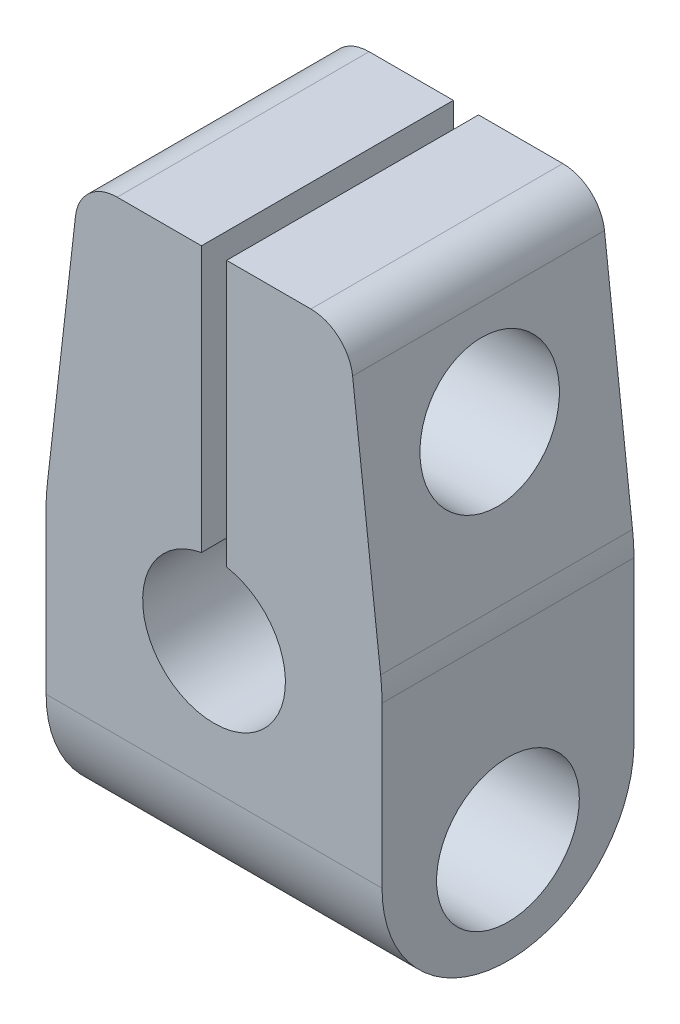
ISO-10303-21;
HEADER;
FILE_DESCRIPTION(('STEP AP214'),'2;1');
FILE_NAME('part.step','',(''),(''),'','','');
FILE_SCHEMA(('AUTOMOTIVE_DESIGN { 1 0 10303 214 1 1 1 1 }'));
ENDSEC;
DATA;
#1=APPLICATION_CONTEXT('core data for automotive mechanical design processes');
#2=APPLICATION_PROTOCOL_DEFINITION('international standard','automotive_design',2000,#1);
#3=PRODUCT_CONTEXT('',#1,'mechanical');
#4=PRODUCT('Part','Part','',(#3));
#5=PRODUCT_RELATED_PRODUCT_CATEGORY('part','',(#4));
#6=PRODUCT_DEFINITION_FORMATION('','',#4);
#7=PRODUCT_DEFINITION_CONTEXT('part definition',#1,'design');
#8=PRODUCT_DEFINITION('design','',#6,#7);
#9=PRODUCT_DEFINITION_SHAPE('','',#8);
#10=(LENGTH_UNIT() NAMED_UNIT(*) SI_UNIT(.MILLI.,.METRE.));
#11=(NAMED_UNIT(*) PLANE_ANGLE_UNIT() SI_UNIT($,.RADIAN.));
#12=(NAMED_UNIT(*) SI_UNIT($,.STERADIAN.) SOLID_ANGLE_UNIT());
#13=UNCERTAINTY_MEASURE_WITH_UNIT(LENGTH_MEASURE(1.E-05),#10,'distance_accuracy_value','');
#14=(GEOMETRIC_REPRESENTATION_CONTEXT(3) GLOBAL_UNCERTAINTY_ASSIGNED_CONTEXT((#13)) GLOBAL_UNIT_ASSIGNED_CONTEXT((#10,
#11,#12)) REPRESENTATION_CONTEXT('',''));
#15=CARTESIAN_POINT('',(0.,0.,0.));
#16=DIRECTION('',(0.,0.,1.));
#17=DIRECTION('',(1.,0.,0.));
#18=AXIS2_PLACEMENT_3D('',#15,#16,#17);
#19=CARTESIAN_POINT('',(4.,-6.5,6.));
#20=DIRECTION('',(-1.,0.,0.));
#21=DIRECTION('',(0.,-1.,0.));
#22=AXIS2_PLACEMENT_3D('',#19,#20,#21);
#23=PLANE('',#22);
#24=CARTESIAN_POINT('',(4.,-3.6,3.));
#25=DIRECTION('',(1.,0.,0.));
#26=DIRECTION('',(0.,0.,-1.));
#27=AXIS2_PLACEMENT_3D('',#24,#25,#26);
#28=CIRCLE('',#27,1.7);
#29=CARTESIAN_POINT('',(4.,-3.6,1.3));
#30=VERTEX_POINT('',#29);
#31=EDGE_CURVE('E312',#30,#30,#28,.T.);
#32=ORIENTED_EDGE('',*,*,#31,.F.);
#33=EDGE_LOOP('',(#32));
#34=FACE_BOUND('',#33,.T.);
#35=DIRECTION('',(0.,0.,1.));
#36=VECTOR('',#35,1.);
#37=CARTESIAN_POINT('',(4.,-3.1,5.9991173190716));
#38=LINE('',#37,#36);
#39=CARTESIAN_POINT('',(4.,-3.1,5.9991173190716));
#40=VERTEX_POINT('',#39);
#41=CARTESIAN_POINT('',(4.,-3.1,6.));
#42=VERTEX_POINT('',#41);
#43=EDGE_CURVE('E295',#40,#42,#38,.T.);
#44=ORIENTED_EDGE('',*,*,#43,.F.);
#45=CARTESIAN_POINT('',(4.,-3.1,2.99911731907161));
#46=DIRECTION('',(-1.,0.,0.));
#47=DIRECTION('',(0.,-1.,0.));
#48=AXIS2_PLACEMENT_3D('',#45,#46,#47);
#49=CIRCLE('',#48,3.);
#50=CARTESIAN_POINT('',(4.,-3.17276885628309,0.));
#51=VERTEX_POINT('',#50);
#52=EDGE_CURVE('E291',#51,#40,#49,.T.);
#53=ORIENTED_EDGE('',*,*,#52,.F.);
#54=DIRECTION('',(0.,1.,0.));
#55=VECTOR('',#54,1.);
#56=CARTESIAN_POINT('',(4.,-6.5,0.));
#57=LINE('',#56,#55);
#58=CARTESIAN_POINT('',(4.,0.714692101296261,0.));
#59=VERTEX_POINT('',#58);
#60=EDGE_CURVE('E172',#51,#59,#57,.T.);
#61=ORIENTED_EDGE('',*,*,#60,.T.);
#62=DIRECTION('',(0.,0.,-1.));
#63=VECTOR('',#62,1.);
#64=CARTESIAN_POINT('',(4.,0.714692101296261,6.));
#65=LINE('',#64,#63);
#66=CARTESIAN_POINT('',(4.,0.714692101296261,6.));
#67=VERTEX_POINT('',#66);
#68=EDGE_CURVE('E11',#67,#59,#65,.T.);
#69=ORIENTED_EDGE('',*,*,#68,.F.);
#70=DIRECTION('',(0.,1.,0.));
#71=VECTOR('',#70,1.);
#72=CARTESIAN_POINT('',(4.,-6.5,6.));
#73=LINE('',#72,#71);
#74=EDGE_CURVE('E114',#42,#67,#73,.T.);
#75=ORIENTED_EDGE('',*,*,#74,.F.);
#76=EDGE_LOOP('',(#44,#53,#61,#69,#75));
#77=FACE_BOUND('',#76,.T.);
#78=ADVANCED_FACE('F37',(#34,#77),#23,.F.);
#79=CARTESIAN_POINT('',(-1.,0.714692101296261,6.));
#80=DIRECTION('',(0.,0.,-1.));
#81=DIRECTION('',(-1.,0.,0.));
#82=AXIS2_PLACEMENT_3D('',#79,#80,#81);
#83=CYLINDRICAL_SURFACE('',#82,5.);
#84=CARTESIAN_POINT('',(-1.,0.714692101296261,0.));
#85=DIRECTION('',(0.,0.,1.));
#86=DIRECTION('',(1.,0.,0.));
#87=AXIS2_PLACEMENT_3D('',#84,#85,#86);
#88=CIRCLE('',#87,5.);
#89=CARTESIAN_POINT('',(3.96754543401684,1.28345598989894,0.));
#90=VERTEX_POINT('',#89);
#91=EDGE_CURVE('E174',#59,#90,#88,.T.);
#92=ORIENTED_EDGE('',*,*,#91,.T.);
#93=DIRECTION('',(0.,0.,-1.));
#94=VECTOR('',#93,1.);
#95=CARTESIAN_POINT('',(3.96754543401684,1.28345598989894,6.));
#96=LINE('',#95,#94);
#97=CARTESIAN_POINT('',(3.96754543401684,1.28345598989894,6.));
#98=VERTEX_POINT('',#97);
#99=EDGE_CURVE('E45',#98,#90,#96,.T.);
#100=ORIENTED_EDGE('',*,*,#99,.F.);
#101=CARTESIAN_POINT('',(-1.,0.714692101296261,6.));
#102=DIRECTION('',(0.,0.,1.));
#103=DIRECTION('',(1.,0.,0.));
#104=AXIS2_PLACEMENT_3D('',#101,#102,#103);
#105=CIRCLE('',#104,5.);
#106=EDGE_CURVE('E318',#67,#98,#105,.T.);
#107=ORIENTED_EDGE('',*,*,#106,.F.);
#108=ORIENTED_EDGE('',*,*,#68,.T.);
#109=EDGE_LOOP('',(#92,#100,#107,#108));
#110=FACE_BOUND('',#109,.T.);
#111=ADVANCED_FACE('F319',(#110),#83,.T.);
#112=CARTESIAN_POINT('',(3.96754543401684,1.28345598989894,6.));
#113=DIRECTION('',(-0.993509086803368,-0.113752777720537,0.));
#114=DIRECTION('',(0.113752777720537,-0.993509086803368,0.));
#115=AXIS2_PLACEMENT_3D('',#112,#113,#114);
#116=PLANE('',#115);
#117=CARTESIAN_POINT('',(3.56491534795233,4.8,3.));
#118=DIRECTION('',(-0.993509086803368,-0.113752777720537,0.));
#119=DIRECTION('',(0.113752777720537,-0.993509086803368,0.));
#120=AXIS2_PLACEMENT_3D('',#117,#118,#119);
#121=ELLIPSE('',#120,1.66077997868032,1.65);
#122=CARTESIAN_POINT('',(3.75383368370987,3.15,3.));
#123=VERTEX_POINT('',#122);
#124=EDGE_CURVE('E309',#123,#123,#121,.T.);
#125=ORIENTED_EDGE('',*,*,#124,.T.);
#126=EDGE_LOOP('',(#125));
#127=FACE_BOUND('',#126,.T.);
#128=DIRECTION('',(-0.113752777720537,0.993509086803368,0.));
#129=VECTOR('',#128,1.);
#130=CARTESIAN_POINT('',(3.96754543401684,1.28345598989894,0.));
#131=LINE('',#130,#129);
#132=CARTESIAN_POINT('',(3.3,7.11375277772054,0.));
#133=VERTEX_POINT('',#132);
#134=EDGE_CURVE('E177',#90,#133,#131,.T.);
#135=ORIENTED_EDGE('',*,*,#134,.T.);
#136=DIRECTION('',(0.,0.,-1.));
#137=VECTOR('',#136,1.);
#138=CARTESIAN_POINT('',(3.3,7.11375277772054,6.));
#139=LINE('',#138,#137);
#140=CARTESIAN_POINT('',(3.3,7.11375277772054,6.));
#141=VERTEX_POINT('',#140);
#142=EDGE_CURVE('E216',#141,#133,#139,.T.);
#143=ORIENTED_EDGE('',*,*,#142,.F.);
#144=DIRECTION('',(-0.113752777720537,0.993509086803368,0.));
#145=VECTOR('',#144,1.);
#146=CARTESIAN_POINT('',(3.96754543401684,1.28345598989894,6.));
#147=LINE('',#146,#145);
#148=EDGE_CURVE('E226',#98,#141,#147,.T.);
#149=ORIENTED_EDGE('',*,*,#148,.F.);
#150=ORIENTED_EDGE('',*,*,#99,.T.);
#151=EDGE_LOOP('',(#135,#143,#149,#150));
#152=FACE_BOUND('',#151,.T.);
#153=ADVANCED_FACE('F224',(#127,#152),#116,.F.);
#154=CARTESIAN_POINT('',(2.30649091319663,7.,6.));
#155=DIRECTION('',(0.,0.,-1.));
#156=DIRECTION('',(-1.,0.,0.));
#157=AXIS2_PLACEMENT_3D('',#154,#155,#156);
#158=CYLINDRICAL_SURFACE('',#157,1.);
#159=CARTESIAN_POINT('',(2.30649091319663,7.,0.));
#160=DIRECTION('',(0.,0.,1.));
#161=DIRECTION('',(1.,0.,0.));
#162=AXIS2_PLACEMENT_3D('',#159,#160,#161);
#163=CIRCLE('',#162,1.);
#164=CARTESIAN_POINT('',(2.30649091319663,8.,0.));
#165=VERTEX_POINT('',#164);
#166=EDGE_CURVE('E179',#133,#165,#163,.T.);
#167=ORIENTED_EDGE('',*,*,#166,.T.);
#168=DIRECTION('',(0.,0.,-1.));
#169=VECTOR('',#168,1.);
#170=CARTESIAN_POINT('',(2.30649091319663,8.,6.));
#171=LINE('',#170,#169);
#172=CARTESIAN_POINT('',(2.30649091319663,8.,6.));
#173=VERTEX_POINT('',#172);
#174=EDGE_CURVE('E213',#173,#165,#171,.T.);
#175=ORIENTED_EDGE('',*,*,#174,.F.);
#176=CARTESIAN_POINT('',(2.30649091319663,7.,6.));
#177=DIRECTION('',(0.,0.,1.));
#178=DIRECTION('',(1.,0.,0.));
#179=AXIS2_PLACEMENT_3D('',#176,#177,#178);
#180=CIRCLE('',#179,1.);
#181=EDGE_CURVE('E247',#141,#173,#180,.T.);
#182=ORIENTED_EDGE('',*,*,#181,.F.);
#183=ORIENTED_EDGE('',*,*,#142,.T.);
#184=EDGE_LOOP('',(#167,#175,#182,#183));
#185=FACE_BOUND('',#184,.T.);
#186=ADVANCED_FACE('F238',(#185),#158,.T.);
#187=CARTESIAN_POINT('',(2.30649091319663,8.,6.));
#188=DIRECTION('',(0.,-1.,0.));
#189=DIRECTION('',(0.,0.,-1.));
#190=AXIS2_PLACEMENT_3D('',#187,#188,#189);
#191=PLANE('',#190);
#192=DIRECTION('',(-1.,0.,0.));
#193=VECTOR('',#192,1.);
#194=CARTESIAN_POINT('',(2.30649091319663,8.,0.));
#195=LINE('',#194,#193);
#196=CARTESIAN_POINT('',(0.299999999999998,8.,0.));
#197=VERTEX_POINT('',#196);
#198=EDGE_CURVE('E181',#165,#197,#195,.T.);
#199=ORIENTED_EDGE('',*,*,#198,.T.);
#200=DIRECTION('',(0.,0.,-1.));
#201=VECTOR('',#200,1.);
#202=CARTESIAN_POINT('',(0.299999999999998,8.,6.));
#203=LINE('',#202,#201);
#204=CARTESIAN_POINT('',(0.299999999999998,8.,6.));
#205=VERTEX_POINT('',#204);
#206=EDGE_CURVE('E210',#205,#197,#203,.T.);
#207=ORIENTED_EDGE('',*,*,#206,.F.);
#208=DIRECTION('',(-1.,0.,0.));
#209=VECTOR('',#208,1.);
#210=CARTESIAN_POINT('',(2.30649091319663,8.,6.));
#211=LINE('',#210,#209);
#212=EDGE_CURVE('E244',#173,#205,#211,.T.);
#213=ORIENTED_EDGE('',*,*,#212,.F.);
#214=ORIENTED_EDGE('',*,*,#174,.T.);
#215=EDGE_LOOP('',(#199,#207,#213,#214));
#216=FACE_BOUND('',#215,.T.);
#217=ADVANCED_FACE('F242',(#216),#191,.F.);
#218=CARTESIAN_POINT('',(0.299999999999998,8.,6.));
#219=DIRECTION('',(1.,0.,0.));
#220=DIRECTION('',(0.,1.,0.));
#221=AXIS2_PLACEMENT_3D('',#218,#219,#220);
#222=PLANE('',#221);
#223=CARTESIAN_POINT('',(0.299999999999999,4.8,3.));
#224=DIRECTION('',(1.,0.,0.));
#225=DIRECTION('',(0.,1.,0.));
#226=AXIS2_PLACEMENT_3D('',#223,#224,#225);
#227=CIRCLE('',#226,1.65);
#228=CARTESIAN_POINT('',(0.299999999999999,6.45,3.));
#229=VERTEX_POINT('',#228);
#230=EDGE_CURVE('E306',#229,#229,#227,.T.);
#231=ORIENTED_EDGE('',*,*,#230,.T.);
#232=EDGE_LOOP('',(#231));
#233=FACE_BOUND('',#232,.T.);
#234=DIRECTION('',(0.,-1.,0.));
#235=VECTOR('',#234,1.);
#236=CARTESIAN_POINT('',(0.299999999999998,8.,0.));
#237=LINE('',#236,#235);
#238=CARTESIAN_POINT('',(0.3,1.67332005306815,0.));
#239=VERTEX_POINT('',#238);
#240=EDGE_CURVE('E183',#197,#239,#237,.T.);
#241=ORIENTED_EDGE('',*,*,#240,.T.);
#242=DIRECTION('',(0.,0.,-1.));
#243=VECTOR('',#242,1.);
#244=CARTESIAN_POINT('',(0.3,1.67332005306815,6.));
#245=LINE('',#244,#243);
#246=CARTESIAN_POINT('',(0.3,1.67332005306815,6.));
#247=VERTEX_POINT('',#246);
#248=EDGE_CURVE('E207',#247,#239,#245,.T.);
#249=ORIENTED_EDGE('',*,*,#248,.F.);
#250=DIRECTION('',(0.,-1.,0.));
#251=VECTOR('',#250,1.);
#252=CARTESIAN_POINT('',(0.299999999999998,8.,6.));
#253=LINE('',#252,#251);
#254=EDGE_CURVE('E246',#205,#247,#253,.T.);
#255=ORIENTED_EDGE('',*,*,#254,.F.);
#256=ORIENTED_EDGE('',*,*,#206,.T.);
#257=EDGE_LOOP('',(#241,#249,#255,#256));
#258=FACE_BOUND('',#257,.T.);
#259=ADVANCED_FACE('F333',(#233,#258),#222,.F.);
#260=CARTESIAN_POINT('',(0.,0.,6.));
#261=DIRECTION('',(0.,0.,-1.));
#262=DIRECTION('',(-1.,0.,0.));
#263=AXIS2_PLACEMENT_3D('',#260,#261,#262);
#264=CYLINDRICAL_SURFACE('',#263,1.7);
#265=CARTESIAN_POINT('',(0.,0.,0.));
#266=DIRECTION('',(0.,0.,-1.));
#267=DIRECTION('',(1.,0.,0.));
#268=AXIS2_PLACEMENT_3D('',#265,#266,#267);
#269=CIRCLE('',#268,1.7);
#270=CARTESIAN_POINT('',(-0.299999999999998,1.67332005306815,0.));
#271=VERTEX_POINT('',#270);
#272=EDGE_CURVE('E185',#239,#271,#269,.T.);
#273=ORIENTED_EDGE('',*,*,#272,.T.);
#274=DIRECTION('',(0.,0.,-1.));
#275=VECTOR('',#274,1.);
#276=CARTESIAN_POINT('',(-0.299999999999998,1.67332005306815,6.));
#277=LINE('',#276,#275);
#278=CARTESIAN_POINT('',(-0.299999999999998,1.67332005306815,6.));
#279=VERTEX_POINT('',#278);
#280=EDGE_CURVE('E204',#279,#271,#277,.T.);
#281=ORIENTED_EDGE('',*,*,#280,.F.);
#282=CARTESIAN_POINT('',(0.,0.,6.));
#283=DIRECTION('',(0.,0.,-1.));
#284=DIRECTION('',(1.,0.,0.));
#285=AXIS2_PLACEMENT_3D('',#282,#283,#284);
#286=CIRCLE('',#285,1.7);
#287=EDGE_CURVE('E249',#247,#279,#286,.T.);
#288=ORIENTED_EDGE('',*,*,#287,.F.);
#289=ORIENTED_EDGE('',*,*,#248,.T.);
#290=EDGE_LOOP('',(#273,#281,#288,#289));
#291=FACE_BOUND('',#290,.T.);
#292=ADVANCED_FACE('F336',(#291),#264,.F.);
#293=CARTESIAN_POINT('',(-0.299999999999998,8.,6.));
#294=DIRECTION('',(-1.,0.,0.));
#295=DIRECTION('',(0.,0.,1.));
#296=AXIS2_PLACEMENT_3D('',#293,#294,#295);
#297=PLANE('',#296);
#298=CARTESIAN_POINT('',(-0.299999999999998,4.8,3.));
#299=DIRECTION('',(-1.,0.,0.));
#300=DIRECTION('',(0.,0.,1.));
#301=AXIS2_PLACEMENT_3D('',#298,#299,#300);
#302=CIRCLE('',#301,1.65);
#303=CARTESIAN_POINT('',(-0.299999999999998,4.8,4.65));
#304=VERTEX_POINT('',#303);
#305=EDGE_CURVE('E303',#304,#304,#302,.T.);
#306=ORIENTED_EDGE('',*,*,#305,.T.);
#307=EDGE_LOOP('',(#306));
#308=FACE_BOUND('',#307,.T.);
#309=DIRECTION('',(0.,1.,0.));
#310=VECTOR('',#309,1.);
#311=CARTESIAN_POINT('',(-0.299999999999998,8.,0.));
#312=LINE('',#311,#310);
#313=CARTESIAN_POINT('',(-0.299999999999998,8.,0.));
#314=VERTEX_POINT('',#313);
#315=EDGE_CURVE('E187',#271,#314,#312,.T.);
#316=ORIENTED_EDGE('',*,*,#315,.T.);
#317=DIRECTION('',(0.,0.,-1.));
#318=VECTOR('',#317,1.);
#319=CARTESIAN_POINT('',(-0.299999999999998,8.,6.));
#320=LINE('',#319,#318);
#321=CARTESIAN_POINT('',(-0.299999999999998,8.,6.));
#322=VERTEX_POINT('',#321);
#323=EDGE_CURVE('E201',#322,#314,#320,.T.);
#324=ORIENTED_EDGE('',*,*,#323,.F.);
#325=DIRECTION('',(0.,1.,0.));
#326=VECTOR('',#325,1.);
#327=CARTESIAN_POINT('',(-0.299999999999998,8.,6.));
#328=LINE('',#327,#326);
#329=EDGE_CURVE('E255',#279,#322,#328,.T.);
#330=ORIENTED_EDGE('',*,*,#329,.F.);
#331=ORIENTED_EDGE('',*,*,#280,.T.);
#332=EDGE_LOOP('',(#316,#324,#330,#331));
#333=FACE_BOUND('',#332,.T.);
#334=ADVANCED_FACE('F261',(#308,#333),#297,.F.);
#335=CARTESIAN_POINT('',(-0.299999999999998,8.,6.));
#336=DIRECTION('',(0.,-1.,0.));
#337=DIRECTION('',(0.,0.,-1.));
#338=AXIS2_PLACEMENT_3D('',#335,#336,#337);
#339=PLANE('',#338);
#340=DIRECTION('',(-1.,0.,0.));
#341=VECTOR('',#340,1.);
#342=CARTESIAN_POINT('',(-0.299999999999998,8.,0.));
#343=LINE('',#342,#341);
#344=CARTESIAN_POINT('',(-2.30649091319663,8.,0.));
#345=VERTEX_POINT('',#344);
#346=EDGE_CURVE('E189',#314,#345,#343,.T.);
#347=ORIENTED_EDGE('',*,*,#346,.T.);
#348=DIRECTION('',(0.,0.,-1.));
#349=VECTOR('',#348,1.);
#350=CARTESIAN_POINT('',(-2.30649091319663,8.,6.));
#351=LINE('',#350,#349);
#352=CARTESIAN_POINT('',(-2.30649091319663,8.,6.));
#353=VERTEX_POINT('',#352);
#354=EDGE_CURVE('E161',#353,#345,#351,.T.);
#355=ORIENTED_EDGE('',*,*,#354,.F.);
#356=DIRECTION('',(-1.,0.,0.));
#357=VECTOR('',#356,1.);
#358=CARTESIAN_POINT('',(-0.299999999999998,8.,6.));
#359=LINE('',#358,#357);
#360=EDGE_CURVE('E149',#322,#353,#359,.T.);
#361=ORIENTED_EDGE('',*,*,#360,.F.);
#362=ORIENTED_EDGE('',*,*,#323,.T.);
#363=EDGE_LOOP('',(#347,#355,#361,#362));
#364=FACE_BOUND('',#363,.T.);
#365=ADVANCED_FACE('F265',(#364),#339,.F.);
#366=CARTESIAN_POINT('',(-2.30649091319663,7.,6.));
#367=DIRECTION('',(0.,0.,-1.));
#368=DIRECTION('',(-1.,0.,0.));
#369=AXIS2_PLACEMENT_3D('',#366,#367,#368);
#370=CYLINDRICAL_SURFACE('',#369,1.);
#371=CARTESIAN_POINT('',(-2.30649091319663,7.,0.));
#372=DIRECTION('',(0.,0.,1.));
#373=DIRECTION('',(-1.,0.,0.));
#374=AXIS2_PLACEMENT_3D('',#371,#372,#373);
#375=CIRCLE('',#374,1.);
#376=CARTESIAN_POINT('',(-3.3,7.11375277772054,0.));
#377=VERTEX_POINT('',#376);
#378=EDGE_CURVE('E158',#345,#377,#375,.T.);
#379=ORIENTED_EDGE('',*,*,#378,.T.);
#380=DIRECTION('',(0.,0.,-1.));
#381=VECTOR('',#380,1.);
#382=CARTESIAN_POINT('',(-3.3,7.11375277772054,6.));
#383=LINE('',#382,#381);
#384=CARTESIAN_POINT('',(-3.3,7.11375277772054,6.));
#385=VERTEX_POINT('',#384);
#386=EDGE_CURVE('E155',#385,#377,#383,.T.);
#387=ORIENTED_EDGE('',*,*,#386,.F.);
#388=CARTESIAN_POINT('',(-2.30649091319663,7.,6.));
#389=DIRECTION('',(0.,0.,1.));
#390=DIRECTION('',(-1.,0.,0.));
#391=AXIS2_PLACEMENT_3D('',#388,#389,#390);
#392=CIRCLE('',#391,1.);
#393=EDGE_CURVE('E142',#353,#385,#392,.T.);
#394=ORIENTED_EDGE('',*,*,#393,.F.);
#395=ORIENTED_EDGE('',*,*,#354,.T.);
#396=EDGE_LOOP('',(#379,#387,#394,#395));
#397=FACE_BOUND('',#396,.T.);
#398=ADVANCED_FACE('F156',(#397),#370,.T.);
#399=CARTESIAN_POINT('',(-3.96754543401684,1.28345598989894,6.));
#400=DIRECTION('',(0.993509086803368,-0.113752777720536,0.));
#401=DIRECTION('',(0.113752777720536,0.993509086803368,0.));
#402=AXIS2_PLACEMENT_3D('',#399,#400,#401);
#403=PLANE('',#402);
#404=CARTESIAN_POINT('',(-3.56491534795233,4.8,3.));
#405=DIRECTION('',(0.993509086803368,-0.113752777720536,0.));
#406=DIRECTION('',(0.113752777720536,0.993509086803368,0.));
#407=AXIS2_PLACEMENT_3D('',#404,#405,#406);
#408=ELLIPSE('',#407,1.66077997868032,1.65);
#409=CARTESIAN_POINT('',(-3.37599701219479,6.45,3.));
#410=VERTEX_POINT('',#409);
#411=EDGE_CURVE('E40',#410,#410,#408,.T.);
#412=ORIENTED_EDGE('',*,*,#411,.T.);
#413=EDGE_LOOP('',(#412));
#414=FACE_BOUND('',#413,.T.);
#415=DIRECTION('',(-0.113752777720536,-0.993509086803368,0.));
#416=VECTOR('',#415,1.);
#417=CARTESIAN_POINT('',(-3.96754543401684,1.28345598989894,0.));
#418=LINE('',#417,#416);
#419=CARTESIAN_POINT('',(-3.96754543401684,1.28345598989894,0.));
#420=VERTEX_POINT('',#419);
#421=EDGE_CURVE('E192',#377,#420,#418,.T.);
#422=ORIENTED_EDGE('',*,*,#421,.T.);
#423=DIRECTION('',(0.,0.,-1.));
#424=VECTOR('',#423,1.);
#425=CARTESIAN_POINT('',(-3.96754543401684,1.28345598989894,6.));
#426=LINE('',#425,#424);
#427=CARTESIAN_POINT('',(-3.96754543401684,1.28345598989894,6.));
#428=VERTEX_POINT('',#427);
#429=EDGE_CURVE('E162',#428,#420,#426,.T.);
#430=ORIENTED_EDGE('',*,*,#429,.F.);
#431=DIRECTION('',(-0.113752777720536,-0.993509086803368,0.));
#432=VECTOR('',#431,1.);
#433=CARTESIAN_POINT('',(-3.96754543401684,1.28345598989894,6.));
#434=LINE('',#433,#432);
#435=EDGE_CURVE('E146',#385,#428,#434,.T.);
#436=ORIENTED_EDGE('',*,*,#435,.F.);
#437=ORIENTED_EDGE('',*,*,#386,.T.);
#438=EDGE_LOOP('',(#422,#430,#436,#437));
#439=FACE_BOUND('',#438,.T.);
#440=ADVANCED_FACE('F164',(#414,#439),#403,.F.);
#441=CARTESIAN_POINT('',(1.,0.714692101296261,6.));
#442=DIRECTION('',(0.,0.,-1.));
#443=DIRECTION('',(-1.,0.,0.));
#444=AXIS2_PLACEMENT_3D('',#441,#442,#443);
#445=CYLINDRICAL_SURFACE('',#444,5.);
#446=CARTESIAN_POINT('',(1.,0.714692101296261,0.));
#447=DIRECTION('',(0.,0.,1.));
#448=DIRECTION('',(-1.,0.,0.));
#449=AXIS2_PLACEMENT_3D('',#446,#447,#448);
#450=CIRCLE('',#449,5.);
#451=CARTESIAN_POINT('',(-4.,0.71469210129626,0.));
#452=VERTEX_POINT('',#451);
#453=EDGE_CURVE('E106',#420,#452,#450,.T.);
#454=ORIENTED_EDGE('',*,*,#453,.T.);
#455=DIRECTION('',(0.,0.,-1.));
#456=VECTOR('',#455,1.);
#457=CARTESIAN_POINT('',(-4.,0.71469210129626,6.));
#458=LINE('',#457,#456);
#459=CARTESIAN_POINT('',(-4.,0.71469210129626,6.));
#460=VERTEX_POINT('',#459);
#461=EDGE_CURVE('E171',#460,#452,#458,.T.);
#462=ORIENTED_EDGE('',*,*,#461,.F.);
#463=CARTESIAN_POINT('',(1.,0.714692101296261,6.));
#464=DIRECTION('',(0.,0.,1.));
#465=DIRECTION('',(-1.,0.,0.));
#466=AXIS2_PLACEMENT_3D('',#463,#464,#465);
#467=CIRCLE('',#466,5.);
#468=EDGE_CURVE('E61',#428,#460,#467,.T.);
#469=ORIENTED_EDGE('',*,*,#468,.F.);
#470=ORIENTED_EDGE('',*,*,#429,.T.);
#471=EDGE_LOOP('',(#454,#462,#469,#470));
#472=FACE_BOUND('',#471,.T.);
#473=ADVANCED_FACE('F267',(#472),#445,.T.);
#474=CARTESIAN_POINT('',(-4.,-6.5,6.));
#475=DIRECTION('',(1.,0.,0.));
#476=DIRECTION('',(0.,0.,-1.));
#477=AXIS2_PLACEMENT_3D('',#474,#475,#476);
#478=PLANE('',#477);
#479=CARTESIAN_POINT('',(-4.,-3.6,3.));
#480=DIRECTION('',(1.,0.,0.));
#481=DIRECTION('',(0.,0.,-1.));
#482=AXIS2_PLACEMENT_3D('',#479,#480,#481);
#483=CIRCLE('',#482,1.7);
#484=CARTESIAN_POINT('',(-4.,-3.6,1.3));
#485=VERTEX_POINT('',#484);
#486=EDGE_CURVE('E175',#485,#485,#483,.T.);
#487=ORIENTED_EDGE('',*,*,#486,.T.);
#488=EDGE_LOOP('',(#487));
#489=FACE_BOUND('',#488,.T.);
#490=DIRECTION('',(0.,-1.,0.));
#491=VECTOR('',#490,1.);
#492=CARTESIAN_POINT('',(-4.,-6.5,0.));
#493=LINE('',#492,#491);
#494=CARTESIAN_POINT('',(-4.,-3.17276885628309,0.));
#495=VERTEX_POINT('',#494);
#496=EDGE_CURVE('E195',#452,#495,#493,.T.);
#497=ORIENTED_EDGE('',*,*,#496,.T.);
#498=CARTESIAN_POINT('',(-4.,-3.1,2.99911731907161));
#499=DIRECTION('',(1.,0.,0.));
#500=DIRECTION('',(0.,0.,1.));
#501=AXIS2_PLACEMENT_3D('',#498,#499,#500);
#502=CIRCLE('',#501,3.);
#503=CARTESIAN_POINT('',(-4.,-3.1,5.9991173190716));
#504=VERTEX_POINT('',#503);
#505=EDGE_CURVE('E52',#504,#495,#502,.T.);
#506=ORIENTED_EDGE('',*,*,#505,.F.);
#507=DIRECTION('',(0.,0.,-1.));
#508=VECTOR('',#507,1.);
#509=CARTESIAN_POINT('',(-4.,-3.1,5.9991173190716));
#510=LINE('',#509,#508);
#511=CARTESIAN_POINT('',(-4.,-3.1,6.));
#512=VERTEX_POINT('',#511);
#513=EDGE_CURVE('E273',#512,#504,#510,.T.);
#514=ORIENTED_EDGE('',*,*,#513,.F.);
#515=DIRECTION('',(0.,-1.,0.));
#516=VECTOR('',#515,1.);
#517=CARTESIAN_POINT('',(-4.,-6.5,6.));
#518=LINE('',#517,#516);
#519=EDGE_CURVE('E166',#460,#512,#518,.T.);
#520=ORIENTED_EDGE('',*,*,#519,.F.);
#521=ORIENTED_EDGE('',*,*,#461,.T.);
#522=EDGE_LOOP('',(#497,#506,#514,#520,#521));
#523=FACE_BOUND('',#522,.T.);
#524=ADVANCED_FACE('F271',(#489,#523),#478,.F.);
#525=CARTESIAN_POINT('',(3.5,-6.5,6.));
#526=DIRECTION('',(0.,0.,1.));
#527=DIRECTION('',(1.,0.,0.));
#528=AXIS2_PLACEMENT_3D('',#525,#526,#527);
#529=PLANE('',#528);
#530=DIRECTION('',(1.,0.,0.));
#531=VECTOR('',#530,1.);
#532=CARTESIAN_POINT('',(4.001,-3.1,6.));
#533=LINE('',#532,#531);
#534=EDGE_CURVE('E276',#512,#42,#533,.T.);
#535=ORIENTED_EDGE('',*,*,#534,.T.);
#536=ORIENTED_EDGE('',*,*,#74,.T.);
#537=ORIENTED_EDGE('',*,*,#106,.T.);
#538=ORIENTED_EDGE('',*,*,#148,.T.);
#539=ORIENTED_EDGE('',*,*,#181,.T.);
#540=ORIENTED_EDGE('',*,*,#212,.T.);
#541=ORIENTED_EDGE('',*,*,#254,.T.);
#542=ORIENTED_EDGE('',*,*,#287,.T.);
#543=ORIENTED_EDGE('',*,*,#329,.T.);
#544=ORIENTED_EDGE('',*,*,#360,.T.);
#545=ORIENTED_EDGE('',*,*,#393,.T.);
#546=ORIENTED_EDGE('',*,*,#435,.T.);
#547=ORIENTED_EDGE('',*,*,#468,.T.);
#548=ORIENTED_EDGE('',*,*,#519,.T.);
#549=EDGE_LOOP('',(#535,#536,#537,#538,#539,#540,#541,#542,#543,#544,#545,#546,#547,#548));
#550=FACE_BOUND('',#549,.T.);
#551=ADVANCED_FACE('F144',(#550),#529,.T.);
#552=CARTESIAN_POINT('',(3.5,-6.5,0.));
#553=DIRECTION('',(0.,0.,1.));
#554=DIRECTION('',(1.,0.,0.));
#555=AXIS2_PLACEMENT_3D('',#552,#553,#554);
#556=PLANE('',#555);
#557=ORIENTED_EDGE('',*,*,#60,.F.);
#558=DIRECTION('',(-1.,0.,0.));
#559=VECTOR('',#558,1.);
#560=CARTESIAN_POINT('',(4.001,-3.17276885628309,0.));
#561=LINE('',#560,#559);
#562=EDGE_CURVE('E288',#51,#495,#561,.T.);
#563=ORIENTED_EDGE('',*,*,#562,.T.);
#564=ORIENTED_EDGE('',*,*,#496,.F.);
#565=ORIENTED_EDGE('',*,*,#453,.F.);
#566=ORIENTED_EDGE('',*,*,#421,.F.);
#567=ORIENTED_EDGE('',*,*,#378,.F.);
#568=ORIENTED_EDGE('',*,*,#346,.F.);
#569=ORIENTED_EDGE('',*,*,#315,.F.);
#570=ORIENTED_EDGE('',*,*,#272,.F.);
#571=ORIENTED_EDGE('',*,*,#240,.F.);
#572=ORIENTED_EDGE('',*,*,#198,.F.);
#573=ORIENTED_EDGE('',*,*,#166,.F.);
#574=ORIENTED_EDGE('',*,*,#134,.F.);
#575=ORIENTED_EDGE('',*,*,#91,.F.);
#576=EDGE_LOOP('',(#557,#563,#564,#565,#566,#567,#568,#569,#570,#571,#572,#573,#574,#575));
#577=FACE_BOUND('',#576,.T.);
#578=ADVANCED_FACE('F233',(#577),#556,.F.);
#579=CARTESIAN_POINT('',(-4.,-3.6,3.));
#580=DIRECTION('',(1.,0.,0.));
#581=DIRECTION('',(0.,0.,-1.));
#582=AXIS2_PLACEMENT_3D('',#579,#580,#581);
#583=CYLINDRICAL_SURFACE('',#582,1.7);
#584=ORIENTED_EDGE('',*,*,#486,.F.);
#585=EDGE_LOOP('',(#584));
#586=FACE_BOUND('',#585,.T.);
#587=ORIENTED_EDGE('',*,*,#31,.T.);
#588=EDGE_LOOP('',(#587));
#589=FACE_BOUND('',#588,.T.);
#590=ADVANCED_FACE('F358',(#586,#589),#583,.F.);
#591=CARTESIAN_POINT('',(-4.,4.8,3.));
#592=DIRECTION('',(1.,0.,0.));
#593=DIRECTION('',(0.,0.,-1.));
#594=AXIS2_PLACEMENT_3D('',#591,#592,#593);
#595=CYLINDRICAL_SURFACE('',#594,1.65);
#596=ORIENTED_EDGE('',*,*,#411,.F.);
#597=EDGE_LOOP('',(#596));
#598=FACE_BOUND('',#597,.T.);
#599=ORIENTED_EDGE('',*,*,#305,.F.);
#600=EDGE_LOOP('',(#599));
#601=FACE_BOUND('',#600,.T.);
#602=ADVANCED_FACE('F363',(#598,#601),#595,.F.);
#603=ORIENTED_EDGE('',*,*,#230,.F.);
#604=EDGE_LOOP('',(#603));
#605=FACE_BOUND('',#604,.T.);
#606=ORIENTED_EDGE('',*,*,#124,.F.);
#607=EDGE_LOOP('',(#606));
#608=FACE_BOUND('',#607,.T.);
#609=ADVANCED_FACE('F365',(#605,#608),#595,.F.);
#610=CARTESIAN_POINT('',(4.001,-3.1,2.99911731907161));
#611=DIRECTION('',(-1.,0.,0.));
#612=DIRECTION('',(0.,0.,1.));
#613=AXIS2_PLACEMENT_3D('',#610,#611,#612);
#614=CYLINDRICAL_SURFACE('',#613,3.);
#615=ORIENTED_EDGE('',*,*,#52,.T.);
#616=DIRECTION('',(-1.,0.,0.));
#617=VECTOR('',#616,1.);
#618=CARTESIAN_POINT('',(4.001,-3.1,5.9991173190716));
#619=LINE('',#618,#617);
#620=EDGE_CURVE('E283',#40,#504,#619,.T.);
#621=ORIENTED_EDGE('',*,*,#620,.T.);
#622=ORIENTED_EDGE('',*,*,#505,.T.);
#623=ORIENTED_EDGE('',*,*,#562,.F.);
#624=EDGE_LOOP('',(#615,#621,#622,#623));
#625=FACE_BOUND('',#624,.T.);
#626=ADVANCED_FACE('F290',(#625),#614,.T.);
#627=CARTESIAN_POINT('',(4.001,-3.1,5.9991173190716));
#628=DIRECTION('',(0.,1.,0.));
#629=DIRECTION('',(0.,0.,1.));
#630=AXIS2_PLACEMENT_3D('',#627,#628,#629);
#631=PLANE('',#630);
#632=ORIENTED_EDGE('',*,*,#43,.T.);
#633=ORIENTED_EDGE('',*,*,#534,.F.);
#634=ORIENTED_EDGE('',*,*,#513,.T.);
#635=ORIENTED_EDGE('',*,*,#620,.F.);
#636=EDGE_LOOP('',(#632,#633,#634,#635));
#637=FACE_BOUND('',#636,.T.);
#638=ADVANCED_FACE('F371',(#637),#631,.F.);
#639=CLOSED_SHELL('',(#78,#111,#153,#186,#217,#259,#292,#334,#365,#398,#440,#473,#524,#551,#578,
#590,#602,#609,#626,#638));
#640=MANIFOLD_SOLID_BREP('B2',#639);
#641=ADVANCED_BREP_SHAPE_REPRESENTATION('',(#18,#640),#14);
#642=SHAPE_DEFINITION_REPRESENTATION(#9,#641);
ENDSEC;
END-ISO-10303-21;
